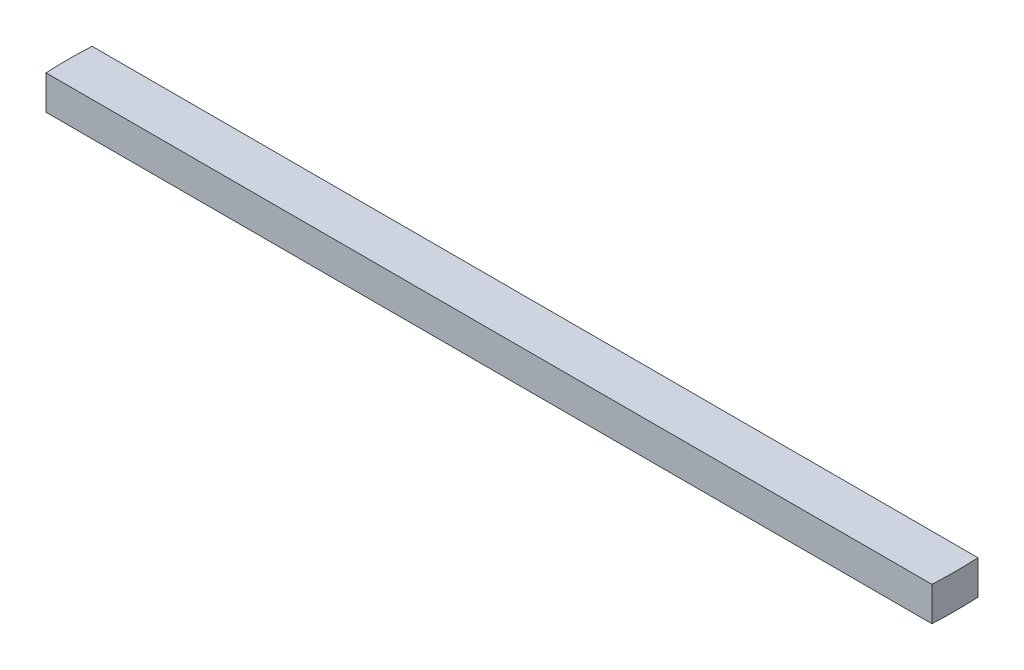
ISO-10303-21;
HEADER;
FILE_DESCRIPTION(('STEP AP214'),'2;1');
FILE_NAME('part.step','',(''),(''),'','','');
FILE_SCHEMA(('AUTOMOTIVE_DESIGN { 1 0 10303 214 1 1 1 1 }'));
ENDSEC;
DATA;
#1=APPLICATION_CONTEXT('core data for automotive mechanical design processes');
#2=APPLICATION_PROTOCOL_DEFINITION('international standard','automotive_design',2000,#1);
#3=PRODUCT_CONTEXT('',#1,'mechanical');
#4=PRODUCT('Part','Part','',(#3));
#5=PRODUCT_RELATED_PRODUCT_CATEGORY('part','',(#4));
#6=PRODUCT_DEFINITION_FORMATION('','',#4);
#7=PRODUCT_DEFINITION_CONTEXT('part definition',#1,'design');
#8=PRODUCT_DEFINITION('design','',#6,#7);
#9=PRODUCT_DEFINITION_SHAPE('','',#8);
#10=(LENGTH_UNIT() NAMED_UNIT(*) SI_UNIT(.MILLI.,.METRE.));
#11=(NAMED_UNIT(*) PLANE_ANGLE_UNIT() SI_UNIT($,.RADIAN.));
#12=(NAMED_UNIT(*) SI_UNIT($,.STERADIAN.) SOLID_ANGLE_UNIT());
#13=UNCERTAINTY_MEASURE_WITH_UNIT(LENGTH_MEASURE(1.E-05),#10,'distance_accuracy_value','');
#14=(GEOMETRIC_REPRESENTATION_CONTEXT(3) GLOBAL_UNCERTAINTY_ASSIGNED_CONTEXT((#13)) GLOBAL_UNIT_ASSIGNED_CONTEXT((#10,
#11,#12)) REPRESENTATION_CONTEXT('',''));
#15=CARTESIAN_POINT('',(0.,0.,0.));
#16=DIRECTION('',(0.,0.,1.));
#17=DIRECTION('',(1.,0.,0.));
#18=AXIS2_PLACEMENT_3D('',#15,#16,#17);
#19=CARTESIAN_POINT('',(0.,152.4,0.));
#20=DIRECTION('',(0.,-1.,0.));
#21=DIRECTION('',(0.,0.,-1.));
#22=AXIS2_PLACEMENT_3D('',#19,#20,#21);
#23=CYLINDRICAL_SURFACE('',#22,1981.2);
#24=CARTESIAN_POINT('',(0.,0.,0.));
#25=DIRECTION('',(0.,1.,0.));
#26=DIRECTION('',(0.,0.,1.));
#27=AXIS2_PLACEMENT_3D('',#24,#25,#26);
#28=CIRCLE('',#27,1981.2);
#29=CARTESIAN_POINT('',(-1978.52683755352,0.,-102.883395552783));
#30=VERTEX_POINT('',#29);
#31=CARTESIAN_POINT('',(-1978.52683755352,0.,102.883395552783));
#32=VERTEX_POINT('',#31);
#33=EDGE_CURVE('E107',#30,#32,#28,.T.);
#34=ORIENTED_EDGE('',*,*,#33,.T.);
#35=DIRECTION('',(0.,-1.,0.));
#36=VECTOR('',#35,1.);
#37=CARTESIAN_POINT('',(-1978.52683755352,152.4,102.883395552783));
#38=LINE('',#37,#36);
#39=CARTESIAN_POINT('',(-1978.52683755352,152.4,102.883395552783));
#40=VERTEX_POINT('',#39);
#41=EDGE_CURVE('E11',#40,#32,#38,.T.);
#42=ORIENTED_EDGE('',*,*,#41,.F.);
#43=CARTESIAN_POINT('',(0.,152.4,0.));
#44=DIRECTION('',(0.,1.,0.));
#45=DIRECTION('',(0.,0.,1.));
#46=AXIS2_PLACEMENT_3D('',#43,#44,#45);
#47=CIRCLE('',#46,1981.2);
#48=CARTESIAN_POINT('',(-1978.52683755352,152.4,-102.883395552783));
#49=VERTEX_POINT('',#48);
#50=EDGE_CURVE('E91',#49,#40,#47,.T.);
#51=ORIENTED_EDGE('',*,*,#50,.F.);
#52=DIRECTION('',(0.,-1.,0.));
#53=VECTOR('',#52,1.);
#54=CARTESIAN_POINT('',(-1978.52683755352,152.4,-102.883395552783));
#55=LINE('',#54,#53);
#56=EDGE_CURVE('E103',#49,#30,#55,.T.);
#57=ORIENTED_EDGE('',*,*,#56,.T.);
#58=EDGE_LOOP('',(#34,#42,#51,#57));
#59=FACE_BOUND('',#58,.T.);
#60=ADVANCED_FACE('F39',(#59),#23,.T.);
#61=CARTESIAN_POINT('',(-1978.52683755352,152.4,102.883395552783));
#62=DIRECTION('',(0.,0.,-1.));
#63=DIRECTION('',(-1.,0.,0.));
#64=AXIS2_PLACEMENT_3D('',#61,#62,#63);
#65=PLANE('',#64);
#66=DIRECTION('',(1.,0.,0.));
#67=VECTOR('',#66,1.);
#68=CARTESIAN_POINT('',(-1978.52683755352,0.,102.883395552783));
#69=LINE('',#68,#67);
#70=CARTESIAN_POINT('',(1978.52683755352,0.,102.883395552783));
#71=VERTEX_POINT('',#70);
#72=EDGE_CURVE('E96',#32,#71,#69,.T.);
#73=ORIENTED_EDGE('',*,*,#72,.T.);
#74=DIRECTION('',(0.,-1.,0.));
#75=VECTOR('',#74,1.);
#76=CARTESIAN_POINT('',(1978.52683755352,152.4,102.883395552783));
#77=LINE('',#76,#75);
#78=CARTESIAN_POINT('',(1978.52683755352,152.4,102.883395552783));
#79=VERTEX_POINT('',#78);
#80=EDGE_CURVE('E48',#79,#71,#77,.T.);
#81=ORIENTED_EDGE('',*,*,#80,.F.);
#82=DIRECTION('',(1.,0.,0.));
#83=VECTOR('',#82,1.);
#84=CARTESIAN_POINT('',(-1978.52683755352,152.4,102.883395552783));
#85=LINE('',#84,#83);
#86=EDGE_CURVE('E86',#40,#79,#85,.T.);
#87=ORIENTED_EDGE('',*,*,#86,.F.);
#88=ORIENTED_EDGE('',*,*,#41,.T.);
#89=EDGE_LOOP('',(#73,#81,#87,#88));
#90=FACE_BOUND('',#89,.T.);
#91=ADVANCED_FACE('F95',(#90),#65,.F.);
#92=CARTESIAN_POINT('',(0.,152.4,0.));
#93=DIRECTION('',(0.,-1.,0.));
#94=DIRECTION('',(0.,0.,-1.));
#95=AXIS2_PLACEMENT_3D('',#92,#93,#94);
#96=CYLINDRICAL_SURFACE('',#95,1981.2);
#97=CARTESIAN_POINT('',(0.,0.,0.));
#98=DIRECTION('',(0.,1.,0.));
#99=DIRECTION('',(0.,0.,1.));
#100=AXIS2_PLACEMENT_3D('',#97,#98,#99);
#101=CIRCLE('',#100,1981.2);
#102=CARTESIAN_POINT('',(1978.52683755352,0.,-102.883395552783));
#103=VERTEX_POINT('',#102);
#104=EDGE_CURVE('E73',#71,#103,#101,.T.);
#105=ORIENTED_EDGE('',*,*,#104,.T.);
#106=DIRECTION('',(0.,-1.,0.));
#107=VECTOR('',#106,1.);
#108=CARTESIAN_POINT('',(1978.52683755352,152.4,-102.883395552783));
#109=LINE('',#108,#107);
#110=CARTESIAN_POINT('',(1978.52683755352,152.4,-102.883395552783));
#111=VERTEX_POINT('',#110);
#112=EDGE_CURVE('E98',#111,#103,#109,.T.);
#113=ORIENTED_EDGE('',*,*,#112,.F.);
#114=CARTESIAN_POINT('',(0.,152.4,0.));
#115=DIRECTION('',(0.,1.,0.));
#116=DIRECTION('',(0.,0.,1.));
#117=AXIS2_PLACEMENT_3D('',#114,#115,#116);
#118=CIRCLE('',#117,1981.2);
#119=EDGE_CURVE('E89',#79,#111,#118,.T.);
#120=ORIENTED_EDGE('',*,*,#119,.F.);
#121=ORIENTED_EDGE('',*,*,#80,.T.);
#122=EDGE_LOOP('',(#105,#113,#120,#121));
#123=FACE_BOUND('',#122,.T.);
#124=ADVANCED_FACE('F99',(#123),#96,.T.);
#125=CARTESIAN_POINT('',(-1978.52683755352,152.4,-102.883395552783));
#126=DIRECTION('',(0.,0.,1.));
#127=DIRECTION('',(1.,0.,0.));
#128=AXIS2_PLACEMENT_3D('',#125,#126,#127);
#129=PLANE('',#128);
#130=DIRECTION('',(-1.,0.,0.));
#131=VECTOR('',#130,1.);
#132=CARTESIAN_POINT('',(-1978.52683755352,0.,-102.883395552783));
#133=LINE('',#132,#131);
#134=EDGE_CURVE('E79',#103,#30,#133,.T.);
#135=ORIENTED_EDGE('',*,*,#134,.T.);
#136=ORIENTED_EDGE('',*,*,#56,.F.);
#137=DIRECTION('',(-1.,0.,0.));
#138=VECTOR('',#137,1.);
#139=CARTESIAN_POINT('',(-1978.52683755352,152.4,-102.883395552783));
#140=LINE('',#139,#138);
#141=EDGE_CURVE('E56',#111,#49,#140,.T.);
#142=ORIENTED_EDGE('',*,*,#141,.F.);
#143=ORIENTED_EDGE('',*,*,#112,.T.);
#144=EDGE_LOOP('',(#135,#136,#142,#143));
#145=FACE_BOUND('',#144,.T.);
#146=ADVANCED_FACE('F120',(#145),#129,.F.);
#147=CARTESIAN_POINT('',(0.,152.4,0.));
#148=DIRECTION('',(0.,1.,0.));
#149=DIRECTION('',(0.,0.,1.));
#150=AXIS2_PLACEMENT_3D('',#147,#148,#149);
#151=PLANE('',#150);
#152=ORIENTED_EDGE('',*,*,#50,.T.);
#153=ORIENTED_EDGE('',*,*,#86,.T.);
#154=ORIENTED_EDGE('',*,*,#119,.T.);
#155=ORIENTED_EDGE('',*,*,#141,.T.);
#156=EDGE_LOOP('',(#152,#153,#154,#155));
#157=FACE_BOUND('',#156,.T.);
#158=ADVANCED_FACE('F87',(#157),#151,.T.);
#159=CARTESIAN_POINT('',(0.,0.,0.));
#160=DIRECTION('',(0.,1.,0.));
#161=DIRECTION('',(0.,0.,1.));
#162=AXIS2_PLACEMENT_3D('',#159,#160,#161);
#163=PLANE('',#162);
#164=ORIENTED_EDGE('',*,*,#33,.F.);
#165=ORIENTED_EDGE('',*,*,#134,.F.);
#166=ORIENTED_EDGE('',*,*,#104,.F.);
#167=ORIENTED_EDGE('',*,*,#72,.F.);
#168=EDGE_LOOP('',(#164,#165,#166,#167));
#169=FACE_BOUND('',#168,.T.);
#170=ADVANCED_FACE('F123',(#169),#163,.F.);
#171=CLOSED_SHELL('',(#60,#91,#124,#146,#158,#170));
#172=MANIFOLD_SOLID_BREP('B2',#171);
#173=ADVANCED_BREP_SHAPE_REPRESENTATION('',(#18,#172),#14);
#174=SHAPE_DEFINITION_REPRESENTATION(#9,#173);
ENDSEC;
END-ISO-10303-21;
